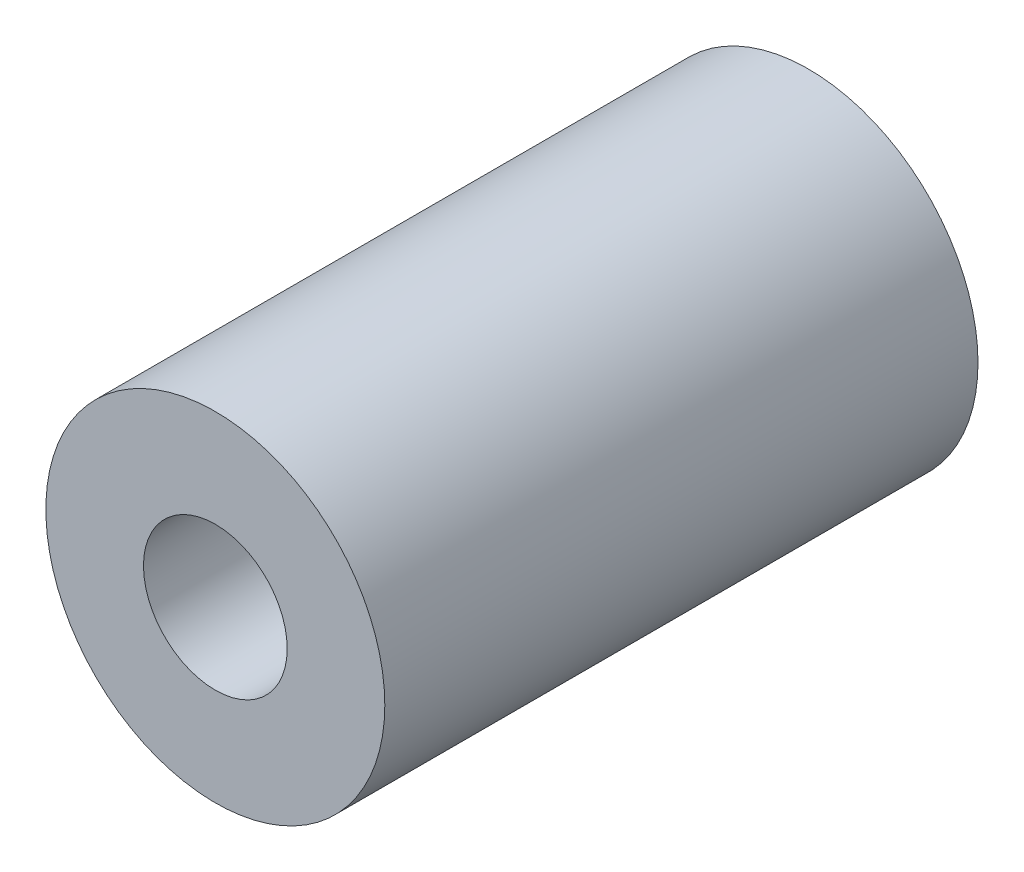
ISO-10303-21;
HEADER;
FILE_DESCRIPTION(('STEP AP214'),'2;1');
FILE_NAME('part.step','',(''),(''),'','','');
FILE_SCHEMA(('AUTOMOTIVE_DESIGN { 1 0 10303 214 1 1 1 1 }'));
ENDSEC;
DATA;
#1=APPLICATION_CONTEXT('core data for automotive mechanical design processes');
#2=APPLICATION_PROTOCOL_DEFINITION('international standard','automotive_design',2000,#1);
#3=PRODUCT_CONTEXT('',#1,'mechanical');
#4=PRODUCT('Part','Part','',(#3));
#5=PRODUCT_RELATED_PRODUCT_CATEGORY('part','',(#4));
#6=PRODUCT_DEFINITION_FORMATION('','',#4);
#7=PRODUCT_DEFINITION_CONTEXT('part definition',#1,'design');
#8=PRODUCT_DEFINITION('design','',#6,#7);
#9=PRODUCT_DEFINITION_SHAPE('','',#8);
#10=(LENGTH_UNIT() NAMED_UNIT(*) SI_UNIT(.MILLI.,.METRE.));
#11=(NAMED_UNIT(*) PLANE_ANGLE_UNIT() SI_UNIT($,.RADIAN.));
#12=(NAMED_UNIT(*) SI_UNIT($,.STERADIAN.) SOLID_ANGLE_UNIT());
#13=UNCERTAINTY_MEASURE_WITH_UNIT(LENGTH_MEASURE(1.E-05),#10,'distance_accuracy_value','');
#14=(GEOMETRIC_REPRESENTATION_CONTEXT(3) GLOBAL_UNCERTAINTY_ASSIGNED_CONTEXT((#13)) GLOBAL_UNIT_ASSIGNED_CONTEXT((#10,
#11,#12)) REPRESENTATION_CONTEXT('',''));
#15=CARTESIAN_POINT('',(0.,0.,0.));
#16=DIRECTION('',(0.,0.,1.));
#17=DIRECTION('',(1.,0.,0.));
#18=AXIS2_PLACEMENT_3D('',#15,#16,#17);
#19=CARTESIAN_POINT('',(-128.341068193594,141.206561724638,8.334375));
#20=DIRECTION('',(0.,0.,-1.));
#21=DIRECTION('',(-1.,0.,0.));
#22=AXIS2_PLACEMENT_3D('',#19,#20,#21);
#23=CYLINDRICAL_SURFACE('',#22,4.7625);
#24=CARTESIAN_POINT('',(-128.341068193594,141.206561724638,8.334375));
#25=DIRECTION('',(0.,0.,1.));
#26=DIRECTION('',(1.,0.,0.));
#27=AXIS2_PLACEMENT_3D('',#24,#25,#26);
#28=CIRCLE('',#27,4.7625);
#29=CARTESIAN_POINT('',(-123.578568193594,141.206561724638,8.334375));
#30=VERTEX_POINT('',#29);
#31=EDGE_CURVE('E10',#30,#30,#28,.T.);
#32=ORIENTED_EDGE('',*,*,#31,.F.);
#33=EDGE_LOOP('',(#32));
#34=FACE_BOUND('',#33,.T.);
#35=CARTESIAN_POINT('',(-128.341068193594,141.206561724638,-8.334375));
#36=DIRECTION('',(0.,0.,1.));
#37=DIRECTION('',(1.,0.,0.));
#38=AXIS2_PLACEMENT_3D('',#35,#36,#37);
#39=CIRCLE('',#38,4.7625);
#40=CARTESIAN_POINT('',(-123.578568193594,141.206561724638,-8.334375));
#41=VERTEX_POINT('',#40);
#42=EDGE_CURVE('E50',#41,#41,#39,.T.);
#43=ORIENTED_EDGE('',*,*,#42,.T.);
#44=EDGE_LOOP('',(#43));
#45=FACE_BOUND('',#44,.T.);
#46=ADVANCED_FACE('F47',(#34,#45),#23,.T.);
#47=CARTESIAN_POINT('',(-128.341068193594,141.206561724638,8.334375));
#48=DIRECTION('',(0.,0.,1.));
#49=DIRECTION('',(1.,0.,0.));
#50=AXIS2_PLACEMENT_3D('',#47,#48,#49);
#51=PLANE('',#50);
#52=CARTESIAN_POINT('',(-128.341068193594,141.206561724638,8.334375));
#53=DIRECTION('',(0.,0.,1.));
#54=DIRECTION('',(1.,0.,0.));
#55=AXIS2_PLACEMENT_3D('',#52,#53,#54);
#56=CIRCLE('',#55,2.0193);
#57=CARTESIAN_POINT('',(-126.321768193594,141.206561724638,8.334375));
#58=VERTEX_POINT('',#57);
#59=EDGE_CURVE('E64',#58,#58,#56,.T.);
#60=ORIENTED_EDGE('',*,*,#59,.F.);
#61=EDGE_LOOP('',(#60));
#62=FACE_BOUND('',#61,.T.);
#63=ORIENTED_EDGE('',*,*,#31,.T.);
#64=EDGE_LOOP('',(#63));
#65=FACE_BOUND('',#64,.T.);
#66=ADVANCED_FACE('F71',(#62,#65),#51,.T.);
#67=CARTESIAN_POINT('',(-128.341068193594,141.206561724638,-8.334375));
#68=DIRECTION('',(0.,0.,1.));
#69=DIRECTION('',(1.,0.,0.));
#70=AXIS2_PLACEMENT_3D('',#67,#68,#69);
#71=PLANE('',#70);
#72=CARTESIAN_POINT('',(-128.341068193594,141.206561724638,-8.334375));
#73=DIRECTION('',(0.,0.,-1.));
#74=DIRECTION('',(-1.,0.,0.));
#75=AXIS2_PLACEMENT_3D('',#72,#73,#74);
#76=CIRCLE('',#75,2.0193);
#77=CARTESIAN_POINT('',(-130.360368193594,141.206561724638,-8.334375));
#78=VERTEX_POINT('',#77);
#79=EDGE_CURVE('E59',#78,#78,#76,.T.);
#80=ORIENTED_EDGE('',*,*,#79,.F.);
#81=EDGE_LOOP('',(#80));
#82=FACE_BOUND('',#81,.T.);
#83=ORIENTED_EDGE('',*,*,#42,.F.);
#84=EDGE_LOOP('',(#83));
#85=FACE_BOUND('',#84,.T.);
#86=ADVANCED_FACE('F73',(#82,#85),#71,.F.);
#87=CARTESIAN_POINT('',(-128.341068193594,141.206561724638,-8.334375));
#88=DIRECTION('',(0.,0.,-1.));
#89=DIRECTION('',(-1.,0.,0.));
#90=AXIS2_PLACEMENT_3D('',#87,#88,#89);
#91=CYLINDRICAL_SURFACE('',#90,2.0193);
#92=ORIENTED_EDGE('',*,*,#79,.T.);
#93=EDGE_LOOP('',(#92));
#94=FACE_BOUND('',#93,.T.);
#95=ORIENTED_EDGE('',*,*,#59,.T.);
#96=EDGE_LOOP('',(#95));
#97=FACE_BOUND('',#96,.T.);
#98=ADVANCED_FACE('F69',(#94,#97),#91,.F.);
#99=CLOSED_SHELL('',(#46,#66,#86,#98));
#100=MANIFOLD_SOLID_BREP('B2',#99);
#101=ADVANCED_BREP_SHAPE_REPRESENTATION('',(#18,#100),#14);
#102=SHAPE_DEFINITION_REPRESENTATION(#9,#101);
ENDSEC;
END-ISO-10303-21;
